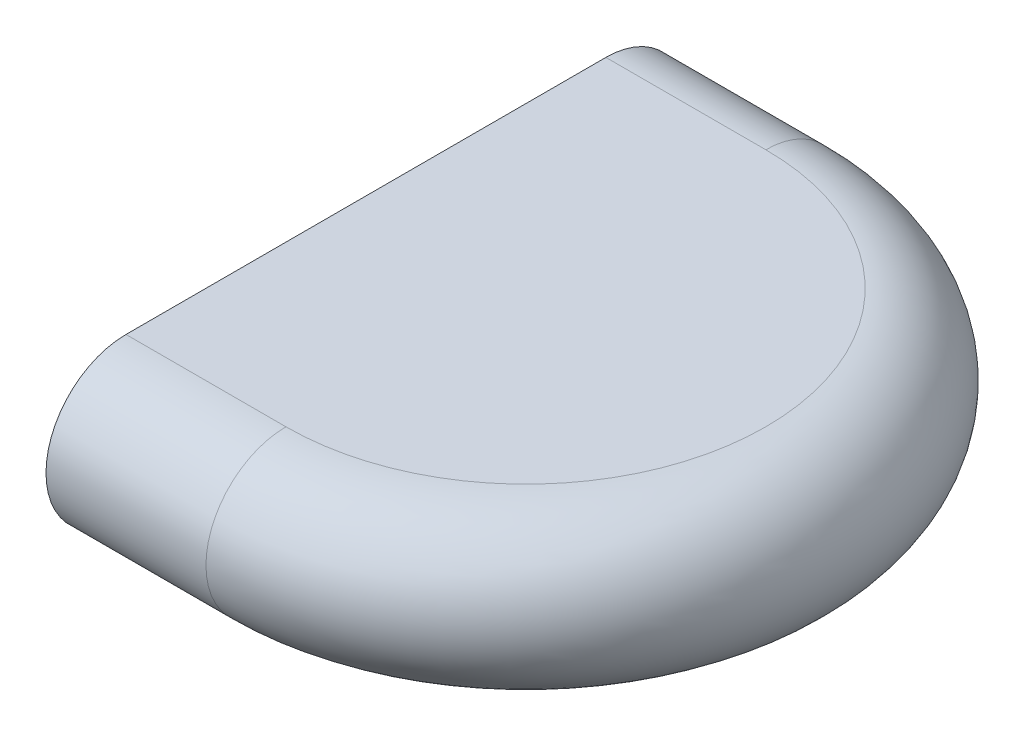
ISO-10303-21;
HEADER;
FILE_DESCRIPTION(('STEP AP214'),'2;1');
FILE_NAME('part.step','',(''),(''),'','','');
FILE_SCHEMA(('AUTOMOTIVE_DESIGN { 1 0 10303 214 1 1 1 1 }'));
ENDSEC;
DATA;
#1=APPLICATION_CONTEXT('core data for automotive mechanical design processes');
#2=APPLICATION_PROTOCOL_DEFINITION('international standard','automotive_design',2000,#1);
#3=PRODUCT_CONTEXT('',#1,'mechanical');
#4=PRODUCT('Part','Part','',(#3));
#5=PRODUCT_RELATED_PRODUCT_CATEGORY('part','',(#4));
#6=PRODUCT_DEFINITION_FORMATION('','',#4);
#7=PRODUCT_DEFINITION_CONTEXT('part definition',#1,'design');
#8=PRODUCT_DEFINITION('design','',#6,#7);
#9=PRODUCT_DEFINITION_SHAPE('','',#8);
#10=(LENGTH_UNIT() NAMED_UNIT(*) SI_UNIT(.MILLI.,.METRE.));
#11=(NAMED_UNIT(*) PLANE_ANGLE_UNIT() SI_UNIT($,.RADIAN.));
#12=(NAMED_UNIT(*) SI_UNIT($,.STERADIAN.) SOLID_ANGLE_UNIT());
#13=UNCERTAINTY_MEASURE_WITH_UNIT(LENGTH_MEASURE(1.E-05),#10,'distance_accuracy_value','');
#14=(GEOMETRIC_REPRESENTATION_CONTEXT(3) GLOBAL_UNCERTAINTY_ASSIGNED_CONTEXT((#13)) GLOBAL_UNIT_ASSIGNED_CONTEXT((#10,
#11,#12)) REPRESENTATION_CONTEXT('',''));
#15=CARTESIAN_POINT('',(0.,0.,0.));
#16=DIRECTION('',(0.,0.,1.));
#17=DIRECTION('',(1.,0.,0.));
#18=AXIS2_PLACEMENT_3D('',#15,#16,#17);
#19=CARTESIAN_POINT('',(0.,1.,-3.));
#20=DIRECTION('',(0.,1.,0.));
#21=DIRECTION('',(0.,0.,1.));
#22=AXIS2_PLACEMENT_3D('',#19,#20,#21);
#23=TOROIDAL_SURFACE('',#22,3.,1.);
#24=CARTESIAN_POINT('',(0.,2.,-3.));
#25=DIRECTION('',(0.,1.,0.));
#26=DIRECTION('',(0.,0.,1.));
#27=AXIS2_PLACEMENT_3D('',#24,#25,#26);
#28=CIRCLE('',#27,3.);
#29=CARTESIAN_POINT('',(0.,2.,0.));
#30=VERTEX_POINT('',#29);
#31=CARTESIAN_POINT('',(0.,2.,-6.));
#32=VERTEX_POINT('',#31);
#33=EDGE_CURVE('E11',#30,#32,#28,.T.);
#34=ORIENTED_EDGE('',*,*,#33,.F.);
#35=CARTESIAN_POINT('',(0.,1.,0.));
#36=DIRECTION('',(-1.,0.,0.));
#37=DIRECTION('',(0.,0.,1.));
#38=AXIS2_PLACEMENT_3D('',#35,#36,#37);
#39=CIRCLE('',#38,1.);
#40=CARTESIAN_POINT('',(0.,0.,0.));
#41=VERTEX_POINT('',#40);
#42=EDGE_CURVE('E90',#41,#30,#39,.T.);
#43=ORIENTED_EDGE('',*,*,#42,.F.);
#44=CARTESIAN_POINT('',(0.,0.,-3.));
#45=DIRECTION('',(0.,1.,0.));
#46=DIRECTION('',(0.,0.,1.));
#47=AXIS2_PLACEMENT_3D('',#44,#45,#46);
#48=CIRCLE('',#47,3.);
#49=CARTESIAN_POINT('',(0.,0.,-6.));
#50=VERTEX_POINT('',#49);
#51=EDGE_CURVE('E41',#41,#50,#48,.T.);
#52=ORIENTED_EDGE('',*,*,#51,.T.);
#53=CARTESIAN_POINT('',(0.,1.,-6.));
#54=DIRECTION('',(1.,0.,0.));
#55=DIRECTION('',(0.,0.,-1.));
#56=AXIS2_PLACEMENT_3D('',#53,#54,#55);
#57=CIRCLE('',#56,1.);
#58=EDGE_CURVE('E91',#50,#32,#57,.T.);
#59=ORIENTED_EDGE('',*,*,#58,.T.);
#60=EDGE_LOOP('',(#34,#43,#52,#59));
#61=FACE_BOUND('',#60,.T.);
#62=ADVANCED_FACE('F33',(#61),#23,.T.);
#63=CARTESIAN_POINT('',(0.,2.,-3.));
#64=DIRECTION('',(0.,-1.,0.));
#65=DIRECTION('',(0.,0.,-1.));
#66=AXIS2_PLACEMENT_3D('',#63,#64,#65);
#67=PLANE('',#66);
#68=ORIENTED_EDGE('',*,*,#33,.T.);
#69=DIRECTION('',(1.,0.,0.));
#70=VECTOR('',#69,1.);
#71=CARTESIAN_POINT('',(-1.99999999999996,2.,-6.00000000000001));
#72=LINE('',#71,#70);
#73=CARTESIAN_POINT('',(-1.99999999999996,2.,-6.00000000000001));
#74=VERTEX_POINT('',#73);
#75=EDGE_CURVE('E75',#74,#32,#72,.T.);
#76=ORIENTED_EDGE('',*,*,#75,.F.);
#77=DIRECTION('',(0.,0.,-1.));
#78=VECTOR('',#77,1.);
#79=CARTESIAN_POINT('',(-2.,2.,0.));
#80=LINE('',#79,#78);
#81=CARTESIAN_POINT('',(-2.,2.,0.));
#82=VERTEX_POINT('',#81);
#83=EDGE_CURVE('E69',#82,#74,#80,.T.);
#84=ORIENTED_EDGE('',*,*,#83,.F.);
#85=DIRECTION('',(1.,0.,0.));
#86=VECTOR('',#85,1.);
#87=CARTESIAN_POINT('',(-2.,2.,0.));
#88=LINE('',#87,#86);
#89=EDGE_CURVE('E72',#82,#30,#88,.T.);
#90=ORIENTED_EDGE('',*,*,#89,.T.);
#91=EDGE_LOOP('',(#68,#76,#84,#90));
#92=FACE_BOUND('',#91,.T.);
#93=ADVANCED_FACE('F35',(#92),#67,.F.);
#94=CARTESIAN_POINT('',(0.,0.,-3.));
#95=DIRECTION('',(0.,1.,0.));
#96=DIRECTION('',(0.,0.,1.));
#97=AXIS2_PLACEMENT_3D('',#94,#95,#96);
#98=PLANE('',#97);
#99=ORIENTED_EDGE('',*,*,#51,.F.);
#100=DIRECTION('',(1.,0.,0.));
#101=VECTOR('',#100,1.);
#102=CARTESIAN_POINT('',(-2.,0.,0.));
#103=LINE('',#102,#101);
#104=CARTESIAN_POINT('',(-2.,0.,0.));
#105=VERTEX_POINT('',#104);
#106=EDGE_CURVE('E100',#105,#41,#103,.T.);
#107=ORIENTED_EDGE('',*,*,#106,.F.);
#108=DIRECTION('',(0.,0.,1.));
#109=VECTOR('',#108,1.);
#110=CARTESIAN_POINT('',(-1.99999999999996,0.,-6.00000000000001));
#111=LINE('',#110,#109);
#112=CARTESIAN_POINT('',(-1.99999999999996,0.,-6.00000000000001));
#113=VERTEX_POINT('',#112);
#114=EDGE_CURVE('E84',#113,#105,#111,.T.);
#115=ORIENTED_EDGE('',*,*,#114,.F.);
#116=DIRECTION('',(1.,0.,0.));
#117=VECTOR('',#116,1.);
#118=CARTESIAN_POINT('',(-1.99999999999996,0.,-6.00000000000001));
#119=LINE('',#118,#117);
#120=EDGE_CURVE('E94',#113,#50,#119,.T.);
#121=ORIENTED_EDGE('',*,*,#120,.T.);
#122=EDGE_LOOP('',(#99,#107,#115,#121));
#123=FACE_BOUND('',#122,.T.);
#124=ADVANCED_FACE('F107',(#123),#98,.F.);
#125=CARTESIAN_POINT('',(-2.,1.,0.));
#126=DIRECTION('',(1.,0.,0.));
#127=DIRECTION('',(0.,0.,-1.));
#128=AXIS2_PLACEMENT_3D('',#125,#126,#127);
#129=CYLINDRICAL_SURFACE('',#128,1.);
#130=ORIENTED_EDGE('',*,*,#42,.T.);
#131=ORIENTED_EDGE('',*,*,#89,.F.);
#132=CARTESIAN_POINT('',(-2.,1.,0.));
#133=DIRECTION('',(-1.,0.,0.));
#134=DIRECTION('',(0.,0.,1.));
#135=AXIS2_PLACEMENT_3D('',#132,#133,#134);
#136=CIRCLE('',#135,1.);
#137=EDGE_CURVE('E79',#105,#82,#136,.T.);
#138=ORIENTED_EDGE('',*,*,#137,.F.);
#139=ORIENTED_EDGE('',*,*,#106,.T.);
#140=EDGE_LOOP('',(#130,#131,#138,#139));
#141=FACE_BOUND('',#140,.T.);
#142=ADVANCED_FACE('F89',(#141),#129,.T.);
#143=CARTESIAN_POINT('',(-1.99999999999996,1.,-6.00000000000001));
#144=DIRECTION('',(1.,0.,0.));
#145=DIRECTION('',(0.,0.,-1.));
#146=AXIS2_PLACEMENT_3D('',#143,#144,#145);
#147=CYLINDRICAL_SURFACE('',#146,1.);
#148=ORIENTED_EDGE('',*,*,#58,.F.);
#149=ORIENTED_EDGE('',*,*,#120,.F.);
#150=CARTESIAN_POINT('',(-1.99999999999996,1.,-6.00000000000001));
#151=DIRECTION('',(-1.,0.,0.));
#152=DIRECTION('',(0.,0.,1.));
#153=AXIS2_PLACEMENT_3D('',#150,#151,#152);
#154=CIRCLE('',#153,1.);
#155=EDGE_CURVE('E78',#74,#113,#154,.T.);
#156=ORIENTED_EDGE('',*,*,#155,.F.);
#157=ORIENTED_EDGE('',*,*,#75,.T.);
#158=EDGE_LOOP('',(#148,#149,#156,#157));
#159=FACE_BOUND('',#158,.T.);
#160=ADVANCED_FACE('F105',(#159),#147,.T.);
#161=CARTESIAN_POINT('',(-2.,1.,0.));
#162=DIRECTION('',(-1.,0.,0.));
#163=DIRECTION('',(0.,0.,1.));
#164=AXIS2_PLACEMENT_3D('',#161,#162,#163);
#165=PLANE('',#164);
#166=ORIENTED_EDGE('',*,*,#137,.T.);
#167=ORIENTED_EDGE('',*,*,#83,.T.);
#168=ORIENTED_EDGE('',*,*,#155,.T.);
#169=ORIENTED_EDGE('',*,*,#114,.T.);
#170=EDGE_LOOP('',(#166,#167,#168,#169));
#171=FACE_BOUND('',#170,.T.);
#172=ADVANCED_FACE('F82',(#171),#165,.T.);
#173=CLOSED_SHELL('',(#62,#93,#124,#142,#160,#172));
#174=MANIFOLD_SOLID_BREP('B2',#173);
#175=ADVANCED_BREP_SHAPE_REPRESENTATION('',(#18,#174),#14);
#176=SHAPE_DEFINITION_REPRESENTATION(#9,#175);
ENDSEC;
END-ISO-10303-21;
